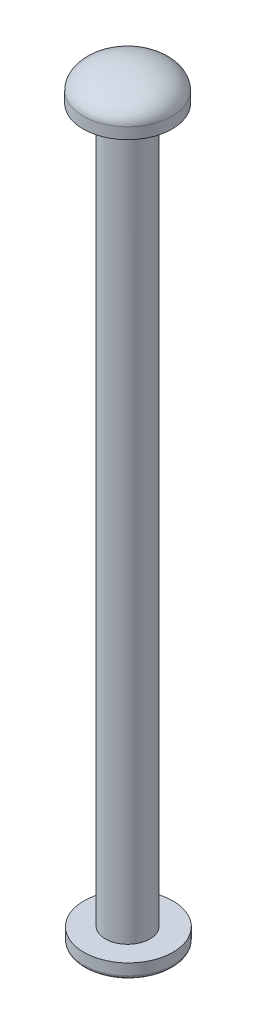
ISO-10303-21;
HEADER;
FILE_DESCRIPTION(('STEP AP214'),'2;1');
FILE_NAME('part.step','',(''),(''),'','','');
FILE_SCHEMA(('AUTOMOTIVE_DESIGN { 1 0 10303 214 1 1 1 1 }'));
ENDSEC;
DATA;
#1=APPLICATION_CONTEXT('core data for automotive mechanical design processes');
#2=APPLICATION_PROTOCOL_DEFINITION('international standard','automotive_design',2000,#1);
#3=PRODUCT_CONTEXT('',#1,'mechanical');
#4=PRODUCT('Part','Part','',(#3));
#5=PRODUCT_RELATED_PRODUCT_CATEGORY('part','',(#4));
#6=PRODUCT_DEFINITION_FORMATION('','',#4);
#7=PRODUCT_DEFINITION_CONTEXT('part definition',#1,'design');
#8=PRODUCT_DEFINITION('design','',#6,#7);
#9=PRODUCT_DEFINITION_SHAPE('','',#8);
#10=(LENGTH_UNIT() NAMED_UNIT(*) SI_UNIT(.MILLI.,.METRE.));
#11=(NAMED_UNIT(*) PLANE_ANGLE_UNIT() SI_UNIT($,.RADIAN.));
#12=(NAMED_UNIT(*) SI_UNIT($,.STERADIAN.) SOLID_ANGLE_UNIT());
#13=UNCERTAINTY_MEASURE_WITH_UNIT(LENGTH_MEASURE(1.E-05),#10,'distance_accuracy_value','');
#14=(GEOMETRIC_REPRESENTATION_CONTEXT(3) GLOBAL_UNCERTAINTY_ASSIGNED_CONTEXT((#13)) GLOBAL_UNIT_ASSIGNED_CONTEXT((#10,
#11,#12)) REPRESENTATION_CONTEXT('',''));
#15=CARTESIAN_POINT('',(0.,0.,0.));
#16=DIRECTION('',(0.,0.,1.));
#17=DIRECTION('',(1.,0.,0.));
#18=AXIS2_PLACEMENT_3D('',#15,#16,#17);
#19=CARTESIAN_POINT('',(0.,32.,0.));
#20=DIRECTION('',(0.,-1.,0.));
#21=DIRECTION('',(0.,0.,-1.));
#22=AXIS2_PLACEMENT_3D('',#19,#20,#21);
#23=CYLINDRICAL_SURFACE('',#22,1.);
#24=CARTESIAN_POINT('',(0.,32.,0.));
#25=DIRECTION('',(0.,1.,0.));
#26=DIRECTION('',(0.,0.,1.));
#27=AXIS2_PLACEMENT_3D('',#24,#25,#26);
#28=CIRCLE('',#27,1.);
#29=CARTESIAN_POINT('',(0.,32.,1.));
#30=VERTEX_POINT('',#29);
#31=EDGE_CURVE('E11',#30,#30,#28,.T.);
#32=ORIENTED_EDGE('',*,*,#31,.F.);
#33=EDGE_LOOP('',(#32));
#34=FACE_BOUND('',#33,.T.);
#35=CARTESIAN_POINT('',(0.,0.,0.));
#36=DIRECTION('',(0.,-1.,0.));
#37=DIRECTION('',(0.,0.,-1.));
#38=AXIS2_PLACEMENT_3D('',#35,#36,#37);
#39=CIRCLE('',#38,1.);
#40=CARTESIAN_POINT('',(0.,0.,-1.));
#41=VERTEX_POINT('',#40);
#42=EDGE_CURVE('E60',#41,#41,#39,.T.);
#43=ORIENTED_EDGE('',*,*,#42,.F.);
#44=EDGE_LOOP('',(#43));
#45=FACE_BOUND('',#44,.T.);
#46=ADVANCED_FACE('F33',(#34,#45),#23,.T.);
#47=CARTESIAN_POINT('',(0.,32.5,0.));
#48=DIRECTION('',(0.,-1.,0.));
#49=DIRECTION('',(0.,0.,-1.));
#50=AXIS2_PLACEMENT_3D('',#47,#48,#49);
#51=CYLINDRICAL_SURFACE('',#50,2.);
#52=CARTESIAN_POINT('',(0.,32.5,0.));
#53=DIRECTION('',(0.,1.,0.));
#54=DIRECTION('',(0.,0.,1.));
#55=AXIS2_PLACEMENT_3D('',#52,#53,#54);
#56=CIRCLE('',#55,2.);
#57=CARTESIAN_POINT('',(0.,32.5,2.));
#58=VERTEX_POINT('',#57);
#59=EDGE_CURVE('E42',#58,#58,#56,.T.);
#60=ORIENTED_EDGE('',*,*,#59,.F.);
#61=EDGE_LOOP('',(#60));
#62=FACE_BOUND('',#61,.T.);
#63=CARTESIAN_POINT('',(0.,32.,0.));
#64=DIRECTION('',(0.,1.,0.));
#65=DIRECTION('',(0.,0.,1.));
#66=AXIS2_PLACEMENT_3D('',#63,#64,#65);
#67=CIRCLE('',#66,2.);
#68=CARTESIAN_POINT('',(0.,32.,2.));
#69=VERTEX_POINT('',#68);
#70=EDGE_CURVE('E57',#69,#69,#67,.T.);
#71=ORIENTED_EDGE('',*,*,#70,.T.);
#72=EDGE_LOOP('',(#71));
#73=FACE_BOUND('',#72,.T.);
#74=ADVANCED_FACE('F53',(#62,#73),#51,.T.);
#75=CARTESIAN_POINT('',(0.,32.5,0.));
#76=DIRECTION('',(1.,0.,0.));
#77=DIRECTION('',(0.,0.,1.));
#78=AXIS2_PLACEMENT_3D('',#75,#76,#77);
#79=ELLIPSE('',#78,2.,1.);
#80=TRIMMED_CURVE('',#79,(PARAMETER_VALUE(4.71238898038469)),
(PARAMETER_VALUE(7.85398163397448)),.T.,.PARAMETER.);
#81=CARTESIAN_POINT('',(0.,31.5,0.));
#82=DIRECTION('',(0.,1.,0.));
#83=AXIS1_PLACEMENT('',#81,#82);
#84=SURFACE_OF_REVOLUTION('',#80,#83);
#85=CARTESIAN_POINT('',(0.,33.5,0.));
#86=VERTEX_POINT('',#85);
#87=VERTEX_LOOP('',#86);
#88=FACE_BOUND('',#87,.T.);
#89=ORIENTED_EDGE('',*,*,#59,.T.);
#90=EDGE_LOOP('',(#89));
#91=FACE_BOUND('',#90,.T.);
#92=ADVANCED_FACE('F49',(#88,#91),#84,.F.);
#93=CARTESIAN_POINT('',(0.,32.,0.));
#94=DIRECTION('',(0.,1.,0.));
#95=DIRECTION('',(0.,0.,1.));
#96=AXIS2_PLACEMENT_3D('',#93,#94,#95);
#97=PLANE('',#96);
#98=ORIENTED_EDGE('',*,*,#31,.T.);
#99=EDGE_LOOP('',(#98));
#100=FACE_BOUND('',#99,.T.);
#101=ORIENTED_EDGE('',*,*,#70,.F.);
#102=EDGE_LOOP('',(#101));
#103=FACE_BOUND('',#102,.T.);
#104=ADVANCED_FACE('F52',(#100,#103),#97,.F.);
#105=CARTESIAN_POINT('',(0.0338177470217138,-0.5,0.));
#106=DIRECTION('',(0.,1.,0.));
#107=DIRECTION('',(0.,0.,1.));
#108=AXIS2_PLACEMENT_3D('',#105,#106,#107);
#109=CYLINDRICAL_SURFACE('',#108,2.);
#110=CARTESIAN_POINT('',(0.0338177470217138,-0.5,0.));
#111=DIRECTION('',(0.,-1.,0.));
#112=DIRECTION('',(0.,0.,-1.));
#113=AXIS2_PLACEMENT_3D('',#110,#111,#112);
#114=CIRCLE('',#113,2.);
#115=CARTESIAN_POINT('',(0.0338177470217138,-0.5,-2.));
#116=VERTEX_POINT('',#115);
#117=EDGE_CURVE('E64',#116,#116,#114,.T.);
#118=ORIENTED_EDGE('',*,*,#117,.F.);
#119=EDGE_LOOP('',(#118));
#120=FACE_BOUND('',#119,.T.);
#121=CARTESIAN_POINT('',(0.0338177470217138,0.,0.));
#122=DIRECTION('',(0.,-1.,0.));
#123=DIRECTION('',(0.,0.,-1.));
#124=AXIS2_PLACEMENT_3D('',#121,#122,#123);
#125=CIRCLE('',#124,2.);
#126=CARTESIAN_POINT('',(0.0338177470217138,0.,-2.));
#127=VERTEX_POINT('',#126);
#128=EDGE_CURVE('E89',#127,#127,#125,.T.);
#129=ORIENTED_EDGE('',*,*,#128,.T.);
#130=EDGE_LOOP('',(#129));
#131=FACE_BOUND('',#130,.T.);
#132=ADVANCED_FACE('F73',(#120,#131),#109,.T.);
#133=CARTESIAN_POINT('',(0.0338177470217138,-0.5,0.));
#134=DIRECTION('',(1.,0.,0.));
#135=DIRECTION('',(0.,0.,-1.));
#136=AXIS2_PLACEMENT_3D('',#133,#134,#135);
#137=ELLIPSE('',#136,2.,0.5);
#138=TRIMMED_CURVE('',#137,(PARAMETER_VALUE(4.71238898038469)),
(PARAMETER_VALUE(7.85398163397448)),.T.,.PARAMETER.);
#139=CARTESIAN_POINT('',(0.0338177470217138,0.,0.));
#140=DIRECTION('',(0.,-1.,0.));
#141=AXIS1_PLACEMENT('',#139,#140);
#142=SURFACE_OF_REVOLUTION('',#138,#141);
#143=CARTESIAN_POINT('',(0.0338177470217138,-1.,0.));
#144=VERTEX_POINT('',#143);
#145=VERTEX_LOOP('',#144);
#146=FACE_BOUND('',#145,.T.);
#147=ORIENTED_EDGE('',*,*,#117,.T.);
#148=EDGE_LOOP('',(#147));
#149=FACE_BOUND('',#148,.T.);
#150=ADVANCED_FACE('F35',(#146,#149),#142,.F.);
#151=CARTESIAN_POINT('',(0.0338177470217138,0.,0.));
#152=DIRECTION('',(0.,-1.,0.));
#153=DIRECTION('',(0.,0.,-1.));
#154=AXIS2_PLACEMENT_3D('',#151,#152,#153);
#155=PLANE('',#154);
#156=ORIENTED_EDGE('',*,*,#42,.T.);
#157=EDGE_LOOP('',(#156));
#158=FACE_BOUND('',#157,.T.);
#159=ORIENTED_EDGE('',*,*,#128,.F.);
#160=EDGE_LOOP('',(#159));
#161=FACE_BOUND('',#160,.T.);
#162=ADVANCED_FACE('F78',(#158,#161),#155,.F.);
#163=CLOSED_SHELL('',(#46,#74,#92,#104,#132,#150,#162));
#164=MANIFOLD_SOLID_BREP('B2',#163);
#165=ADVANCED_BREP_SHAPE_REPRESENTATION('',(#18,#164),#14);
#166=SHAPE_DEFINITION_REPRESENTATION(#9,#165);
ENDSEC;
END-ISO-10303-21;
